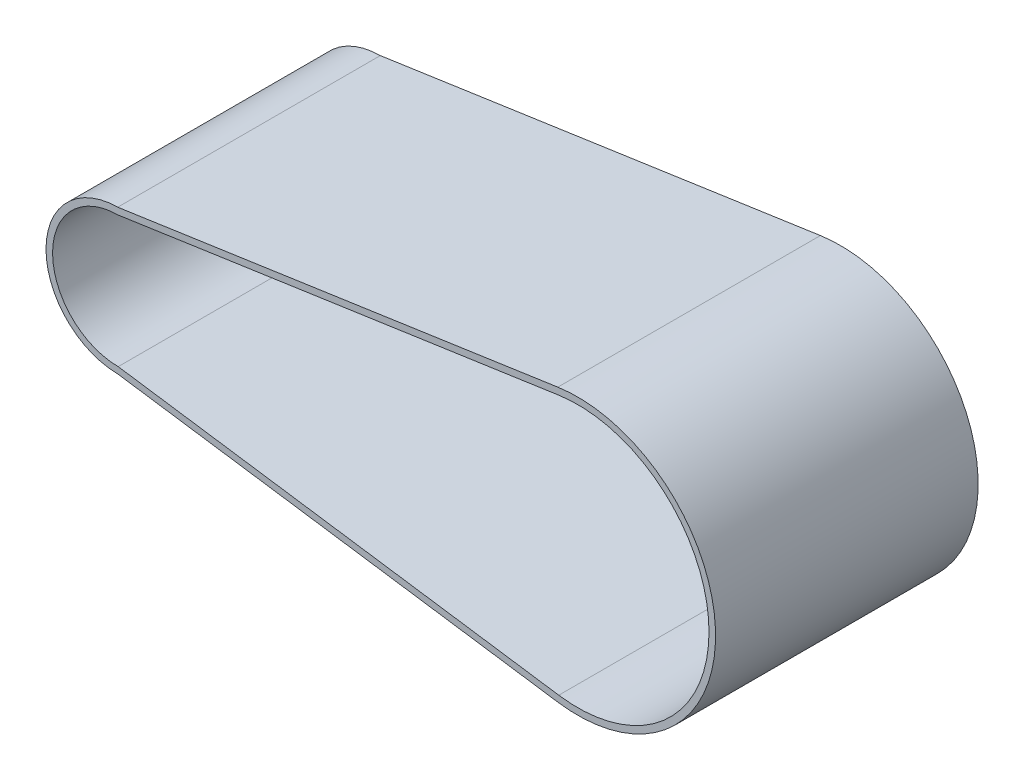
ISO-10303-21;
HEADER;
FILE_DESCRIPTION(('STEP AP214'),'2;1');
FILE_NAME('part.step','',(''),(''),'','','');
FILE_SCHEMA(('AUTOMOTIVE_DESIGN { 1 0 10303 214 1 1 1 1 }'));
ENDSEC;
DATA;
#1=APPLICATION_CONTEXT('core data for automotive mechanical design processes');
#2=APPLICATION_PROTOCOL_DEFINITION('international standard','automotive_design',2000,#1);
#3=PRODUCT_CONTEXT('',#1,'mechanical');
#4=PRODUCT('Part','Part','',(#3));
#5=PRODUCT_RELATED_PRODUCT_CATEGORY('part','',(#4));
#6=PRODUCT_DEFINITION_FORMATION('','',#4);
#7=PRODUCT_DEFINITION_CONTEXT('part definition',#1,'design');
#8=PRODUCT_DEFINITION('design','',#6,#7);
#9=PRODUCT_DEFINITION_SHAPE('','',#8);
#10=(LENGTH_UNIT() NAMED_UNIT(*) SI_UNIT(.MILLI.,.METRE.));
#11=(NAMED_UNIT(*) PLANE_ANGLE_UNIT() SI_UNIT($,.RADIAN.));
#12=(NAMED_UNIT(*) SI_UNIT($,.STERADIAN.) SOLID_ANGLE_UNIT());
#13=UNCERTAINTY_MEASURE_WITH_UNIT(LENGTH_MEASURE(1.E-05),#10,'distance_accuracy_value','');
#14=(GEOMETRIC_REPRESENTATION_CONTEXT(3) GLOBAL_UNCERTAINTY_ASSIGNED_CONTEXT((#13)) GLOBAL_UNIT_ASSIGNED_CONTEXT((#10,
#11,#12)) REPRESENTATION_CONTEXT('',''));
#15=CARTESIAN_POINT('',(0.,0.,0.));
#16=DIRECTION('',(0.,0.,1.));
#17=DIRECTION('',(1.,0.,0.));
#18=AXIS2_PLACEMENT_3D('',#15,#16,#17);
#19=CARTESIAN_POINT('',(350.,0.,200.));
#20=DIRECTION('',(0.,0.,1.));
#21=DIRECTION('',(1.,0.,0.));
#22=AXIS2_PLACEMENT_3D('',#19,#20,#21);
#23=PLANE('',#22);
#24=CARTESIAN_POINT('',(350.,0.,200.));
#25=DIRECTION('',(0.,0.,1.));
#26=DIRECTION('',(1.,0.,0.));
#27=AXIS2_PLACEMENT_3D('',#24,#25,#26);
#28=CIRCLE('',#27,105.);
#29=CARTESIAN_POINT('',(334.842892964563,-103.900250751941,200.));
#30=VERTEX_POINT('',#29);
#31=CARTESIAN_POINT('',(334.842892964563,103.900250751941,200.));
#32=VERTEX_POINT('',#31);
#33=EDGE_CURVE('E153',#30,#32,#28,.T.);
#34=ORIENTED_EDGE('',*,*,#33,.T.);
#35=DIRECTION('',(-0.989526197637538,-0.144353400337495,0.));
#36=VECTOR('',#35,1.);
#37=CARTESIAN_POINT('',(334.842892964563,103.900250751941,200.));
#38=LINE('',#37,#36);
#39=CARTESIAN_POINT('',(-0.371378358426554,54.9987461503887,200.));
#40=VERTEX_POINT('',#39);
#41=EDGE_CURVE('E157',#32,#40,#38,.T.);
#42=ORIENTED_EDGE('',*,*,#41,.T.);
#43=CARTESIAN_POINT('',(0.,0.,200.));
#44=DIRECTION('',(0.,0.,1.));
#45=DIRECTION('',(1.,0.,0.));
#46=AXIS2_PLACEMENT_3D('',#43,#44,#45);
#47=CIRCLE('',#46,55.);
#48=CARTESIAN_POINT('',(-0.371378358426563,-54.9987461503887,200.));
#49=VERTEX_POINT('',#48);
#50=EDGE_CURVE('E161',#40,#49,#47,.T.);
#51=ORIENTED_EDGE('',*,*,#50,.T.);
#52=DIRECTION('',(0.989526197637538,-0.144353400337495,0.));
#53=VECTOR('',#52,1.);
#54=CARTESIAN_POINT('',(-0.371378358426551,-54.9987461503887,200.));
#55=LINE('',#54,#53);
#56=EDGE_CURVE('E164',#49,#30,#55,.T.);
#57=ORIENTED_EDGE('',*,*,#56,.T.);
#58=EDGE_LOOP('',(#34,#42,#51,#57));
#59=FACE_BOUND('',#58,.T.);
#60=DIRECTION('',(0.989526197637538,-0.144353400337495,0.));
#61=VECTOR('',#60,1.);
#62=CARTESIAN_POINT('',(0.,-50.,200.));
#63=LINE('',#62,#61);
#64=CARTESIAN_POINT('',(0.,-50.,200.));
#65=VERTEX_POINT('',#64);
#66=CARTESIAN_POINT('',(335.564659966251,-98.9526197637537,200.));
#67=VERTEX_POINT('',#66);
#68=EDGE_CURVE('E114',#65,#67,#63,.T.);
#69=ORIENTED_EDGE('',*,*,#68,.F.);
#70=CARTESIAN_POINT('',(0.,0.,200.));
#71=DIRECTION('',(0.,0.,1.));
#72=DIRECTION('',(1.,0.,0.));
#73=AXIS2_PLACEMENT_3D('',#70,#71,#72);
#74=CIRCLE('',#73,50.);
#75=CARTESIAN_POINT('',(0.,50.,200.));
#76=VERTEX_POINT('',#75);
#77=EDGE_CURVE('E105',#76,#65,#74,.T.);
#78=ORIENTED_EDGE('',*,*,#77,.F.);
#79=DIRECTION('',(-0.989526197637538,-0.144353400337495,0.));
#80=VECTOR('',#79,1.);
#81=CARTESIAN_POINT('',(335.564659966251,98.9526197637538,200.));
#82=LINE('',#81,#80);
#83=CARTESIAN_POINT('',(335.56465996625,98.9526197637537,200.));
#84=VERTEX_POINT('',#83);
#85=EDGE_CURVE('E131',#84,#76,#82,.T.);
#86=ORIENTED_EDGE('',*,*,#85,.F.);
#87=CARTESIAN_POINT('',(350.,0.,200.));
#88=DIRECTION('',(0.,0.,1.));
#89=DIRECTION('',(1.,0.,0.));
#90=AXIS2_PLACEMENT_3D('',#87,#88,#89);
#91=CIRCLE('',#90,100.);
#92=EDGE_CURVE('E127',#67,#84,#91,.T.);
#93=ORIENTED_EDGE('',*,*,#92,.F.);
#94=EDGE_LOOP('',(#69,#78,#86,#93));
#95=FACE_BOUND('',#94,.T.);
#96=ADVANCED_FACE('F39',(#59,#95),#23,.T.);
#97=CARTESIAN_POINT('',(350.,0.,0.));
#98=DIRECTION('',(0.,0.,1.));
#99=DIRECTION('',(1.,0.,0.));
#100=AXIS2_PLACEMENT_3D('',#97,#98,#99);
#101=PLANE('',#100);
#102=CARTESIAN_POINT('',(350.,0.,0.));
#103=DIRECTION('',(0.,0.,1.));
#104=DIRECTION('',(1.,0.,0.));
#105=AXIS2_PLACEMENT_3D('',#102,#103,#104);
#106=CIRCLE('',#105,105.);
#107=CARTESIAN_POINT('',(334.842892964563,-103.900250751941,0.));
#108=VERTEX_POINT('',#107);
#109=CARTESIAN_POINT('',(334.842892964563,103.900250751941,0.));
#110=VERTEX_POINT('',#109);
#111=EDGE_CURVE('E123',#108,#110,#106,.T.);
#112=ORIENTED_EDGE('',*,*,#111,.F.);
#113=DIRECTION('',(0.989526197637538,-0.144353400337495,0.));
#114=VECTOR('',#113,1.);
#115=CARTESIAN_POINT('',(-0.371378358426551,-54.9987461503887,0.));
#116=LINE('',#115,#114);
#117=CARTESIAN_POINT('',(-0.371378358426563,-54.9987461503887,0.));
#118=VERTEX_POINT('',#117);
#119=EDGE_CURVE('E158',#118,#108,#116,.T.);
#120=ORIENTED_EDGE('',*,*,#119,.F.);
#121=CARTESIAN_POINT('',(0.,0.,0.));
#122=DIRECTION('',(0.,0.,1.));
#123=DIRECTION('',(1.,0.,0.));
#124=AXIS2_PLACEMENT_3D('',#121,#122,#123);
#125=CIRCLE('',#124,55.);
#126=CARTESIAN_POINT('',(-0.371378358426554,54.9987461503887,0.));
#127=VERTEX_POINT('',#126);
#128=EDGE_CURVE('E174',#127,#118,#125,.T.);
#129=ORIENTED_EDGE('',*,*,#128,.F.);
#130=DIRECTION('',(-0.989526197637538,-0.144353400337495,0.));
#131=VECTOR('',#130,1.);
#132=CARTESIAN_POINT('',(334.842892964563,103.900250751941,0.));
#133=LINE('',#132,#131);
#134=EDGE_CURVE('E171',#110,#127,#133,.T.);
#135=ORIENTED_EDGE('',*,*,#134,.F.);
#136=EDGE_LOOP('',(#112,#120,#129,#135));
#137=FACE_BOUND('',#136,.T.);
#138=CARTESIAN_POINT('',(0.,0.,0.));
#139=DIRECTION('',(0.,0.,1.));
#140=DIRECTION('',(1.,0.,0.));
#141=AXIS2_PLACEMENT_3D('',#138,#139,#140);
#142=CIRCLE('',#141,50.);
#143=CARTESIAN_POINT('',(0.,50.,0.));
#144=VERTEX_POINT('',#143);
#145=CARTESIAN_POINT('',(0.,-50.,0.));
#146=VERTEX_POINT('',#145);
#147=EDGE_CURVE('E63',#144,#146,#142,.T.);
#148=ORIENTED_EDGE('',*,*,#147,.T.);
#149=DIRECTION('',(0.989526197637538,-0.144353400337495,0.));
#150=VECTOR('',#149,1.);
#151=CARTESIAN_POINT('',(0.,-50.,0.));
#152=LINE('',#151,#150);
#153=CARTESIAN_POINT('',(335.564659966251,-98.9526197637537,0.));
#154=VERTEX_POINT('',#153);
#155=EDGE_CURVE('E121',#146,#154,#152,.T.);
#156=ORIENTED_EDGE('',*,*,#155,.T.);
#157=CARTESIAN_POINT('',(350.,0.,0.));
#158=DIRECTION('',(0.,0.,1.));
#159=DIRECTION('',(1.,0.,0.));
#160=AXIS2_PLACEMENT_3D('',#157,#158,#159);
#161=CIRCLE('',#160,100.);
#162=CARTESIAN_POINT('',(335.56465996625,98.9526197637537,0.));
#163=VERTEX_POINT('',#162);
#164=EDGE_CURVE('E140',#154,#163,#161,.T.);
#165=ORIENTED_EDGE('',*,*,#164,.T.);
#166=DIRECTION('',(-0.989526197637538,-0.144353400337495,0.));
#167=VECTOR('',#166,1.);
#168=CARTESIAN_POINT('',(335.564659966251,98.9526197637538,0.));
#169=LINE('',#168,#167);
#170=EDGE_CURVE('E115',#163,#144,#169,.T.);
#171=ORIENTED_EDGE('',*,*,#170,.T.);
#172=EDGE_LOOP('',(#148,#156,#165,#171));
#173=FACE_BOUND('',#172,.T.);
#174=ADVANCED_FACE('F197',(#137,#173),#101,.F.);
#175=CARTESIAN_POINT('',(350.,0.,200.));
#176=DIRECTION('',(0.,0.,-1.));
#177=DIRECTION('',(-1.,0.,0.));
#178=AXIS2_PLACEMENT_3D('',#175,#176,#177);
#179=CYLINDRICAL_SURFACE('',#178,105.);
#180=ORIENTED_EDGE('',*,*,#111,.T.);
#181=DIRECTION('',(0.,0.,-1.));
#182=VECTOR('',#181,1.);
#183=CARTESIAN_POINT('',(334.842892964563,103.900250751941,200.));
#184=LINE('',#183,#182);
#185=EDGE_CURVE('E11',#32,#110,#184,.T.);
#186=ORIENTED_EDGE('',*,*,#185,.F.);
#187=ORIENTED_EDGE('',*,*,#33,.F.);
#188=DIRECTION('',(0.,0.,-1.));
#189=VECTOR('',#188,1.);
#190=CARTESIAN_POINT('',(334.842892964563,-103.900250751941,200.));
#191=LINE('',#190,#189);
#192=EDGE_CURVE('E167',#30,#108,#191,.T.);
#193=ORIENTED_EDGE('',*,*,#192,.T.);
#194=EDGE_LOOP('',(#180,#186,#187,#193));
#195=FACE_BOUND('',#194,.T.);
#196=ADVANCED_FACE('F41',(#195),#179,.T.);
#197=CARTESIAN_POINT('',(334.842892964563,103.900250751941,200.));
#198=DIRECTION('',(0.144353400337495,-0.989526197637538,0.));
#199=DIRECTION('',(0.989526197637538,0.144353400337495,0.));
#200=AXIS2_PLACEMENT_3D('',#197,#198,#199);
#201=PLANE('',#200);
#202=ORIENTED_EDGE('',*,*,#134,.T.);
#203=DIRECTION('',(0.,0.,-1.));
#204=VECTOR('',#203,1.);
#205=CARTESIAN_POINT('',(-0.371378358426554,54.9987461503887,200.));
#206=LINE('',#205,#204);
#207=EDGE_CURVE('E48',#40,#127,#206,.T.);
#208=ORIENTED_EDGE('',*,*,#207,.F.);
#209=ORIENTED_EDGE('',*,*,#41,.F.);
#210=ORIENTED_EDGE('',*,*,#185,.T.);
#211=EDGE_LOOP('',(#202,#208,#209,#210));
#212=FACE_BOUND('',#211,.T.);
#213=ADVANCED_FACE('F207',(#212),#201,.F.);
#214=CARTESIAN_POINT('',(0.,0.,200.));
#215=DIRECTION('',(0.,0.,-1.));
#216=DIRECTION('',(-1.,0.,0.));
#217=AXIS2_PLACEMENT_3D('',#214,#215,#216);
#218=CYLINDRICAL_SURFACE('',#217,55.);
#219=ORIENTED_EDGE('',*,*,#128,.T.);
#220=DIRECTION('',(0.,0.,-1.));
#221=VECTOR('',#220,1.);
#222=CARTESIAN_POINT('',(-0.371378358426563,-54.9987461503887,200.));
#223=LINE('',#222,#221);
#224=EDGE_CURVE('E182',#49,#118,#223,.T.);
#225=ORIENTED_EDGE('',*,*,#224,.F.);
#226=ORIENTED_EDGE('',*,*,#50,.F.);
#227=ORIENTED_EDGE('',*,*,#207,.T.);
#228=EDGE_LOOP('',(#219,#225,#226,#227));
#229=FACE_BOUND('',#228,.T.);
#230=ADVANCED_FACE('F191',(#229),#218,.T.);
#231=CARTESIAN_POINT('',(-0.371378358426551,-54.9987461503887,200.));
#232=DIRECTION('',(0.144353400337495,0.989526197637538,0.));
#233=DIRECTION('',(-0.989526197637538,0.144353400337495,0.));
#234=AXIS2_PLACEMENT_3D('',#231,#232,#233);
#235=PLANE('',#234);
#236=ORIENTED_EDGE('',*,*,#119,.T.);
#237=ORIENTED_EDGE('',*,*,#192,.F.);
#238=ORIENTED_EDGE('',*,*,#56,.F.);
#239=ORIENTED_EDGE('',*,*,#224,.T.);
#240=EDGE_LOOP('',(#236,#237,#238,#239));
#241=FACE_BOUND('',#240,.T.);
#242=ADVANCED_FACE('F201',(#241),#235,.F.);
#243=CARTESIAN_POINT('',(0.,0.,200.));
#244=DIRECTION('',(0.,0.,-1.));
#245=DIRECTION('',(-1.,0.,0.));
#246=AXIS2_PLACEMENT_3D('',#243,#244,#245);
#247=CYLINDRICAL_SURFACE('',#246,50.);
#248=ORIENTED_EDGE('',*,*,#147,.F.);
#249=DIRECTION('',(0.,0.,-1.));
#250=VECTOR('',#249,1.);
#251=CARTESIAN_POINT('',(0.,50.,200.));
#252=LINE('',#251,#250);
#253=EDGE_CURVE('E109',#76,#144,#252,.T.);
#254=ORIENTED_EDGE('',*,*,#253,.F.);
#255=ORIENTED_EDGE('',*,*,#77,.T.);
#256=DIRECTION('',(0.,0.,-1.));
#257=VECTOR('',#256,1.);
#258=CARTESIAN_POINT('',(0.,-50.,200.));
#259=LINE('',#258,#257);
#260=EDGE_CURVE('E108',#65,#146,#259,.T.);
#261=ORIENTED_EDGE('',*,*,#260,.T.);
#262=EDGE_LOOP('',(#248,#254,#255,#261));
#263=FACE_BOUND('',#262,.T.);
#264=ADVANCED_FACE('F107',(#263),#247,.F.);
#265=CARTESIAN_POINT('',(0.,-50.,200.));
#266=DIRECTION('',(0.144353400337495,0.989526197637538,0.));
#267=DIRECTION('',(-0.989526197637538,0.144353400337495,0.));
#268=AXIS2_PLACEMENT_3D('',#265,#266,#267);
#269=PLANE('',#268);
#270=ORIENTED_EDGE('',*,*,#155,.F.);
#271=ORIENTED_EDGE('',*,*,#260,.F.);
#272=ORIENTED_EDGE('',*,*,#68,.T.);
#273=DIRECTION('',(0.,0.,-1.));
#274=VECTOR('',#273,1.);
#275=CARTESIAN_POINT('',(335.564659966251,-98.9526197637537,200.));
#276=LINE('',#275,#274);
#277=EDGE_CURVE('E124',#67,#154,#276,.T.);
#278=ORIENTED_EDGE('',*,*,#277,.T.);
#279=EDGE_LOOP('',(#270,#271,#272,#278));
#280=FACE_BOUND('',#279,.T.);
#281=ADVANCED_FACE('F118',(#280),#269,.T.);
#282=CARTESIAN_POINT('',(350.,0.,200.));
#283=DIRECTION('',(0.,0.,-1.));
#284=DIRECTION('',(-1.,0.,0.));
#285=AXIS2_PLACEMENT_3D('',#282,#283,#284);
#286=CYLINDRICAL_SURFACE('',#285,100.);
#287=ORIENTED_EDGE('',*,*,#164,.F.);
#288=ORIENTED_EDGE('',*,*,#277,.F.);
#289=ORIENTED_EDGE('',*,*,#92,.T.);
#290=DIRECTION('',(0.,0.,-1.));
#291=VECTOR('',#290,1.);
#292=CARTESIAN_POINT('',(335.56465996625,98.9526197637537,200.));
#293=LINE('',#292,#291);
#294=EDGE_CURVE('E55',#84,#163,#293,.T.);
#295=ORIENTED_EDGE('',*,*,#294,.T.);
#296=EDGE_LOOP('',(#287,#288,#289,#295));
#297=FACE_BOUND('',#296,.T.);
#298=ADVANCED_FACE('F230',(#297),#286,.F.);
#299=CARTESIAN_POINT('',(335.564659966251,98.9526197637538,200.));
#300=DIRECTION('',(0.144353400337495,-0.989526197637538,0.));
#301=DIRECTION('',(0.989526197637538,0.144353400337495,0.));
#302=AXIS2_PLACEMENT_3D('',#299,#300,#301);
#303=PLANE('',#302);
#304=ORIENTED_EDGE('',*,*,#170,.F.);
#305=ORIENTED_EDGE('',*,*,#294,.F.);
#306=ORIENTED_EDGE('',*,*,#85,.T.);
#307=ORIENTED_EDGE('',*,*,#253,.T.);
#308=EDGE_LOOP('',(#304,#305,#306,#307));
#309=FACE_BOUND('',#308,.T.);
#310=ADVANCED_FACE('F234',(#309),#303,.T.);
#311=CLOSED_SHELL('',(#96,#174,#196,#213,#230,#242,#264,#281,#298,#310));
#312=MANIFOLD_SOLID_BREP('B2',#311);
#313=ADVANCED_BREP_SHAPE_REPRESENTATION('',(#18,#312),#14);
#314=SHAPE_DEFINITION_REPRESENTATION(#9,#313);
ENDSEC;
END-ISO-10303-21;
